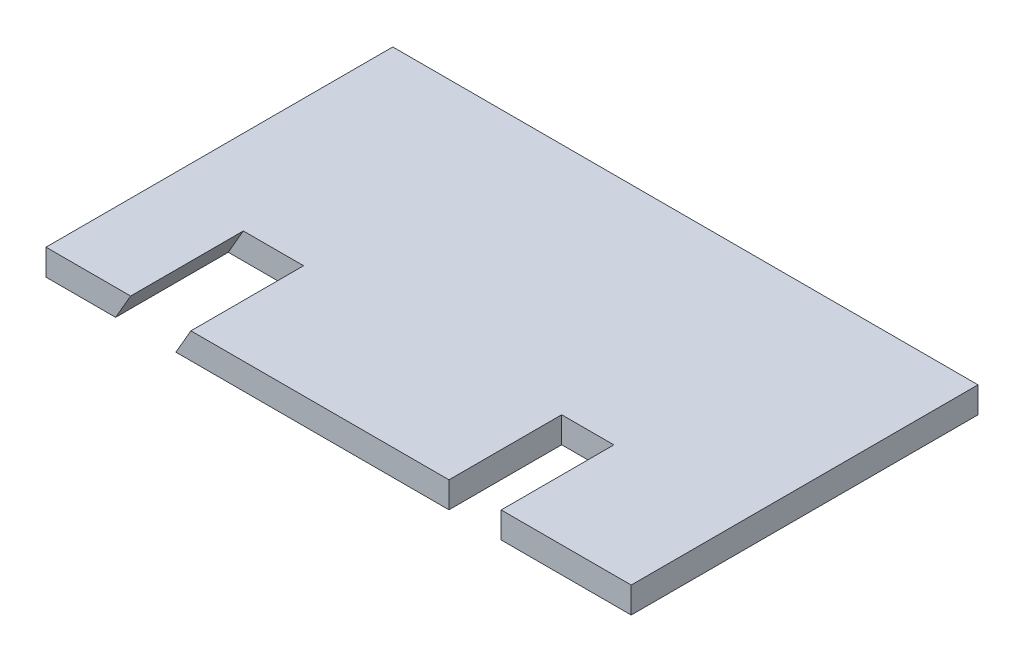
ISO-10303-21;
HEADER;
FILE_DESCRIPTION(('STEP AP214'),'2;1');
FILE_NAME('part.step','',(''),(''),'','','');
FILE_SCHEMA(('AUTOMOTIVE_DESIGN { 1 0 10303 214 1 1 1 1 }'));
ENDSEC;
DATA;
#1=APPLICATION_CONTEXT('core data for automotive mechanical design processes');
#2=APPLICATION_PROTOCOL_DEFINITION('international standard','automotive_design',2000,#1);
#3=PRODUCT_CONTEXT('',#1,'mechanical');
#4=PRODUCT('Part','Part','',(#3));
#5=PRODUCT_RELATED_PRODUCT_CATEGORY('part','',(#4));
#6=PRODUCT_DEFINITION_FORMATION('','',#4);
#7=PRODUCT_DEFINITION_CONTEXT('part definition',#1,'design');
#8=PRODUCT_DEFINITION('design','',#6,#7);
#9=PRODUCT_DEFINITION_SHAPE('','',#8);
#10=(LENGTH_UNIT() NAMED_UNIT(*) SI_UNIT(.MILLI.,.METRE.));
#11=(NAMED_UNIT(*) PLANE_ANGLE_UNIT() SI_UNIT($,.RADIAN.));
#12=(NAMED_UNIT(*) SI_UNIT($,.STERADIAN.) SOLID_ANGLE_UNIT());
#13=UNCERTAINTY_MEASURE_WITH_UNIT(LENGTH_MEASURE(1.E-05),#10,'distance_accuracy_value','');
#14=(GEOMETRIC_REPRESENTATION_CONTEXT(3) GLOBAL_UNCERTAINTY_ASSIGNED_CONTEXT((#13)) GLOBAL_UNIT_ASSIGNED_CONTEXT((#10,
#11,#12)) REPRESENTATION_CONTEXT('',''));
#15=CARTESIAN_POINT('',(0.,0.,0.));
#16=DIRECTION('',(0.,0.,1.));
#17=DIRECTION('',(1.,0.,0.));
#18=AXIS2_PLACEMENT_3D('',#15,#16,#17);
#19=CARTESIAN_POINT('',(0.,0.,80.));
#20=DIRECTION('',(0.,0.,1.));
#21=DIRECTION('',(1.,0.,0.));
#22=AXIS2_PLACEMENT_3D('',#19,#20,#21);
#23=PLANE('',#22);
#24=DIRECTION('',(0.,-1.,0.));
#25=VECTOR('',#24,1.);
#26=CARTESIAN_POINT('',(25.46,3.,80.));
#27=LINE('',#26,#25);
#28=CARTESIAN_POINT('',(25.46,3.,80.));
#29=VERTEX_POINT('',#28);
#30=CARTESIAN_POINT('',(25.46,-3.,80.));
#31=VERTEX_POINT('',#30);
#32=EDGE_CURVE('E127',#29,#31,#27,.T.);
#33=ORIENTED_EDGE('',*,*,#32,.F.);
#34=DIRECTION('',(-1.,0.,0.));
#35=VECTOR('',#34,1.);
#36=CARTESIAN_POINT('',(-67.5,3.,80.));
#37=LINE('',#36,#35);
#38=CARTESIAN_POINT('',(-34.0758983848622,3.,80.));
#39=VERTEX_POINT('',#38);
#40=EDGE_CURVE('E192',#29,#39,#37,.T.);
#41=ORIENTED_EDGE('',*,*,#40,.T.);
#42=DIRECTION('',(0.5,0.866025403784439,0.));
#43=VECTOR('',#42,1.);
#44=CARTESIAN_POINT('',(-34.0758983848622,3.,80.));
#45=LINE('',#44,#43);
#46=CARTESIAN_POINT('',(-37.54,-3.,80.));
#47=VERTEX_POINT('',#46);
#48=EDGE_CURVE('E164',#47,#39,#45,.T.);
#49=ORIENTED_EDGE('',*,*,#48,.F.);
#50=DIRECTION('',(1.,0.,0.));
#51=VECTOR('',#50,1.);
#52=CARTESIAN_POINT('',(-67.5,-3.,80.));
#53=LINE('',#52,#51);
#54=EDGE_CURVE('E199',#47,#31,#53,.T.);
#55=ORIENTED_EDGE('',*,*,#54,.T.);
#56=EDGE_LOOP('',(#33,#41,#49,#55));
#57=FACE_BOUND('',#56,.T.);
#58=ADVANCED_FACE('F33',(#57),#23,.T.);
#59=DIRECTION('',(0.,1.,0.));
#60=VECTOR('',#59,1.);
#61=CARTESIAN_POINT('',(37.5,3.,80.));
#62=LINE('',#61,#60);
#63=CARTESIAN_POINT('',(37.5,-3.,80.));
#64=VERTEX_POINT('',#63);
#65=CARTESIAN_POINT('',(37.5,3.,80.));
#66=VERTEX_POINT('',#65);
#67=EDGE_CURVE('E141',#64,#66,#62,.T.);
#68=ORIENTED_EDGE('',*,*,#67,.F.);
#69=CARTESIAN_POINT('',(67.5,-3.,80.));
#70=VERTEX_POINT('',#69);
#71=EDGE_CURVE('E194',#64,#70,#53,.T.);
#72=ORIENTED_EDGE('',*,*,#71,.T.);
#73=DIRECTION('',(0.,1.,0.));
#74=VECTOR('',#73,1.);
#75=CARTESIAN_POINT('',(67.5,3.,80.));
#76=LINE('',#75,#74);
#77=CARTESIAN_POINT('',(67.5,3.,80.));
#78=VERTEX_POINT('',#77);
#79=EDGE_CURVE('E183',#70,#78,#76,.T.);
#80=ORIENTED_EDGE('',*,*,#79,.T.);
#81=EDGE_CURVE('E188',#78,#66,#37,.T.);
#82=ORIENTED_EDGE('',*,*,#81,.T.);
#83=EDGE_LOOP('',(#68,#72,#80,#82));
#84=FACE_BOUND('',#83,.T.);
#85=ADVANCED_FACE('F230',(#84),#23,.T.);
#86=CARTESIAN_POINT('',(67.5,3.,80.));
#87=DIRECTION('',(-1.,0.,0.));
#88=DIRECTION('',(0.,0.,1.));
#89=AXIS2_PLACEMENT_3D('',#86,#87,#88);
#90=PLANE('',#89);
#91=DIRECTION('',(0.,1.,0.));
#92=VECTOR('',#91,1.);
#93=CARTESIAN_POINT('',(67.5,3.,0.));
#94=LINE('',#93,#92);
#95=CARTESIAN_POINT('',(67.5,-3.,0.));
#96=VERTEX_POINT('',#95);
#97=CARTESIAN_POINT('',(67.5,3.,0.));
#98=VERTEX_POINT('',#97);
#99=EDGE_CURVE('E155',#96,#98,#94,.T.);
#100=ORIENTED_EDGE('',*,*,#99,.T.);
#101=DIRECTION('',(0.,0.,-1.));
#102=VECTOR('',#101,1.);
#103=CARTESIAN_POINT('',(67.5,3.,80.));
#104=LINE('',#103,#102);
#105=EDGE_CURVE('E11',#78,#98,#104,.T.);
#106=ORIENTED_EDGE('',*,*,#105,.F.);
#107=ORIENTED_EDGE('',*,*,#79,.F.);
#108=DIRECTION('',(0.,0.,-1.));
#109=VECTOR('',#108,1.);
#110=CARTESIAN_POINT('',(67.5,-3.,80.));
#111=LINE('',#110,#109);
#112=EDGE_CURVE('E198',#70,#96,#111,.T.);
#113=ORIENTED_EDGE('',*,*,#112,.T.);
#114=EDGE_LOOP('',(#100,#106,#107,#113));
#115=FACE_BOUND('',#114,.T.);
#116=ADVANCED_FACE('F35',(#115),#90,.F.);
#117=CARTESIAN_POINT('',(-67.5,3.,80.));
#118=DIRECTION('',(0.,-1.,0.));
#119=DIRECTION('',(0.,0.,-1.));
#120=AXIS2_PLACEMENT_3D('',#117,#118,#119);
#121=PLANE('',#120);
#122=ORIENTED_EDGE('',*,*,#40,.F.);
#123=DIRECTION('',(0.,0.,1.));
#124=VECTOR('',#123,1.);
#125=CARTESIAN_POINT('',(25.46,3.,54.));
#126=LINE('',#125,#124);
#127=CARTESIAN_POINT('',(25.46,3.,54.));
#128=VERTEX_POINT('',#127);
#129=EDGE_CURVE('E153',#128,#29,#126,.T.);
#130=ORIENTED_EDGE('',*,*,#129,.F.);
#131=DIRECTION('',(-1.,0.,0.));
#132=VECTOR('',#131,1.);
#133=CARTESIAN_POINT('',(25.46,3.,54.));
#134=LINE('',#133,#132);
#135=CARTESIAN_POINT('',(37.5,3.,54.));
#136=VERTEX_POINT('',#135);
#137=EDGE_CURVE('E132',#136,#128,#134,.T.);
#138=ORIENTED_EDGE('',*,*,#137,.F.);
#139=DIRECTION('',(0.,0.,1.));
#140=VECTOR('',#139,1.);
#141=CARTESIAN_POINT('',(37.5,3.,54.));
#142=LINE('',#141,#140);
#143=EDGE_CURVE('E156',#136,#66,#142,.T.);
#144=ORIENTED_EDGE('',*,*,#143,.T.);
#145=ORIENTED_EDGE('',*,*,#81,.F.);
#146=ORIENTED_EDGE('',*,*,#105,.T.);
#147=DIRECTION('',(-1.,0.,0.));
#148=VECTOR('',#147,1.);
#149=CARTESIAN_POINT('',(-67.5,3.,0.));
#150=LINE('',#149,#148);
#151=CARTESIAN_POINT('',(-67.5,3.,0.));
#152=VERTEX_POINT('',#151);
#153=EDGE_CURVE('E202',#98,#152,#150,.T.);
#154=ORIENTED_EDGE('',*,*,#153,.T.);
#155=DIRECTION('',(0.,0.,-1.));
#156=VECTOR('',#155,1.);
#157=CARTESIAN_POINT('',(-67.5,3.,80.));
#158=LINE('',#157,#156);
#159=CARTESIAN_POINT('',(-67.5,3.,80.));
#160=VERTEX_POINT('',#159);
#161=EDGE_CURVE('E41',#160,#152,#158,.T.);
#162=ORIENTED_EDGE('',*,*,#161,.F.);
#163=CARTESIAN_POINT('',(-47.9784928669484,3.,80.));
#164=VERTEX_POINT('',#163);
#165=EDGE_CURVE('E186',#164,#160,#37,.T.);
#166=ORIENTED_EDGE('',*,*,#165,.F.);
#167=DIRECTION('',(0.,0.,1.));
#168=VECTOR('',#167,1.);
#169=CARTESIAN_POINT('',(-47.9784928669484,3.,54.));
#170=LINE('',#169,#168);
#171=CARTESIAN_POINT('',(-47.9784928669484,3.,54.));
#172=VERTEX_POINT('',#171);
#173=EDGE_CURVE('E56',#172,#164,#170,.T.);
#174=ORIENTED_EDGE('',*,*,#173,.F.);
#175=DIRECTION('',(-1.,0.,0.));
#176=VECTOR('',#175,1.);
#177=CARTESIAN_POINT('',(-47.9784928669484,3.,54.));
#178=LINE('',#177,#176);
#179=CARTESIAN_POINT('',(-34.0758983848622,3.,54.));
#180=VERTEX_POINT('',#179);
#181=EDGE_CURVE('E160',#180,#172,#178,.T.);
#182=ORIENTED_EDGE('',*,*,#181,.F.);
#183=DIRECTION('',(0.,0.,1.));
#184=VECTOR('',#183,1.);
#185=CARTESIAN_POINT('',(-34.0758983848622,3.,54.));
#186=LINE('',#185,#184);
#187=EDGE_CURVE('E151',#180,#39,#186,.T.);
#188=ORIENTED_EDGE('',*,*,#187,.T.);
#189=EDGE_LOOP('',(#122,#130,#138,#144,#145,#146,#154,#162,#166,#174,#182,#188));
#190=FACE_BOUND('',#189,.T.);
#191=ADVANCED_FACE('F243',(#190),#121,.F.);
#192=CARTESIAN_POINT('',(-67.5,3.,80.));
#193=DIRECTION('',(1.,0.,0.));
#194=DIRECTION('',(0.,0.,-1.));
#195=AXIS2_PLACEMENT_3D('',#192,#193,#194);
#196=PLANE('',#195);
#197=DIRECTION('',(0.,-1.,0.));
#198=VECTOR('',#197,1.);
#199=CARTESIAN_POINT('',(-67.5,3.,0.));
#200=LINE('',#199,#198);
#201=CARTESIAN_POINT('',(-67.5,-3.,0.));
#202=VERTEX_POINT('',#201);
#203=EDGE_CURVE('E204',#152,#202,#200,.T.);
#204=ORIENTED_EDGE('',*,*,#203,.T.);
#205=DIRECTION('',(0.,0.,-1.));
#206=VECTOR('',#205,1.);
#207=CARTESIAN_POINT('',(-67.5,-3.,80.));
#208=LINE('',#207,#206);
#209=CARTESIAN_POINT('',(-67.5,-3.,80.));
#210=VERTEX_POINT('',#209);
#211=EDGE_CURVE('E209',#210,#202,#208,.T.);
#212=ORIENTED_EDGE('',*,*,#211,.F.);
#213=DIRECTION('',(0.,-1.,0.));
#214=VECTOR('',#213,1.);
#215=CARTESIAN_POINT('',(-67.5,3.,80.));
#216=LINE('',#215,#214);
#217=EDGE_CURVE('E191',#160,#210,#216,.T.);
#218=ORIENTED_EDGE('',*,*,#217,.F.);
#219=ORIENTED_EDGE('',*,*,#161,.T.);
#220=EDGE_LOOP('',(#204,#212,#218,#219));
#221=FACE_BOUND('',#220,.T.);
#222=ADVANCED_FACE('F216',(#221),#196,.F.);
#223=CARTESIAN_POINT('',(-67.5,-3.,80.));
#224=DIRECTION('',(0.,1.,0.));
#225=DIRECTION('',(0.,0.,1.));
#226=AXIS2_PLACEMENT_3D('',#223,#224,#225);
#227=PLANE('',#226);
#228=DIRECTION('',(1.,0.,0.));
#229=VECTOR('',#228,1.);
#230=CARTESIAN_POINT('',(25.46,-3.,54.));
#231=LINE('',#230,#229);
#232=CARTESIAN_POINT('',(25.46,-3.,54.));
#233=VERTEX_POINT('',#232);
#234=CARTESIAN_POINT('',(37.5,-3.,54.));
#235=VERTEX_POINT('',#234);
#236=EDGE_CURVE('E138',#233,#235,#231,.T.);
#237=ORIENTED_EDGE('',*,*,#236,.F.);
#238=DIRECTION('',(0.,0.,1.));
#239=VECTOR('',#238,1.);
#240=CARTESIAN_POINT('',(25.46,-3.,54.));
#241=LINE('',#240,#239);
#242=EDGE_CURVE('E121',#233,#31,#241,.T.);
#243=ORIENTED_EDGE('',*,*,#242,.T.);
#244=ORIENTED_EDGE('',*,*,#54,.F.);
#245=DIRECTION('',(0.,0.,1.));
#246=VECTOR('',#245,1.);
#247=CARTESIAN_POINT('',(-37.54,-3.,54.));
#248=LINE('',#247,#246);
#249=CARTESIAN_POINT('',(-37.54,-3.,54.));
#250=VERTEX_POINT('',#249);
#251=EDGE_CURVE('E177',#250,#47,#248,.T.);
#252=ORIENTED_EDGE('',*,*,#251,.F.);
#253=DIRECTION('',(1.,0.,0.));
#254=VECTOR('',#253,1.);
#255=CARTESIAN_POINT('',(-51.4425944820862,-3.,54.));
#256=LINE('',#255,#254);
#257=CARTESIAN_POINT('',(-51.4425944820862,-3.,54.));
#258=VERTEX_POINT('',#257);
#259=EDGE_CURVE('E167',#258,#250,#256,.T.);
#260=ORIENTED_EDGE('',*,*,#259,.F.);
#261=DIRECTION('',(0.,0.,1.));
#262=VECTOR('',#261,1.);
#263=CARTESIAN_POINT('',(-51.4425944820862,-3.,54.));
#264=LINE('',#263,#262);
#265=CARTESIAN_POINT('',(-51.4425944820862,-3.,80.));
#266=VERTEX_POINT('',#265);
#267=EDGE_CURVE('E179',#258,#266,#264,.T.);
#268=ORIENTED_EDGE('',*,*,#267,.T.);
#269=EDGE_CURVE('E195',#210,#266,#53,.T.);
#270=ORIENTED_EDGE('',*,*,#269,.F.);
#271=ORIENTED_EDGE('',*,*,#211,.T.);
#272=DIRECTION('',(1.,0.,0.));
#273=VECTOR('',#272,1.);
#274=CARTESIAN_POINT('',(-67.5,-3.,0.));
#275=LINE('',#274,#273);
#276=EDGE_CURVE('E187',#202,#96,#275,.T.);
#277=ORIENTED_EDGE('',*,*,#276,.T.);
#278=ORIENTED_EDGE('',*,*,#112,.F.);
#279=ORIENTED_EDGE('',*,*,#71,.F.);
#280=DIRECTION('',(0.,0.,1.));
#281=VECTOR('',#280,1.);
#282=CARTESIAN_POINT('',(37.5,-3.,54.));
#283=LINE('',#282,#281);
#284=EDGE_CURVE('E48',#235,#64,#283,.T.);
#285=ORIENTED_EDGE('',*,*,#284,.F.);
#286=EDGE_LOOP('',(#237,#243,#244,#252,#260,#268,#270,#271,#277,#278,#279,#285));
#287=FACE_BOUND('',#286,.T.);
#288=ADVANCED_FACE('F143',(#287),#227,.F.);
#289=DIRECTION('',(-0.499999999999997,-0.86602540378444,0.));
#290=VECTOR('',#289,1.);
#291=CARTESIAN_POINT('',(-47.9784928669484,3.,80.));
#292=LINE('',#291,#290);
#293=EDGE_CURVE('E172',#164,#266,#292,.T.);
#294=ORIENTED_EDGE('',*,*,#293,.F.);
#295=ORIENTED_EDGE('',*,*,#165,.T.);
#296=ORIENTED_EDGE('',*,*,#217,.T.);
#297=ORIENTED_EDGE('',*,*,#269,.T.);
#298=EDGE_LOOP('',(#294,#295,#296,#297));
#299=FACE_BOUND('',#298,.T.);
#300=ADVANCED_FACE('F256',(#299),#23,.T.);
#301=CARTESIAN_POINT('',(0.,0.,0.));
#302=DIRECTION('',(0.,0.,1.));
#303=DIRECTION('',(1.,0.,0.));
#304=AXIS2_PLACEMENT_3D('',#301,#302,#303);
#305=PLANE('',#304);
#306=ORIENTED_EDGE('',*,*,#99,.F.);
#307=ORIENTED_EDGE('',*,*,#276,.F.);
#308=ORIENTED_EDGE('',*,*,#203,.F.);
#309=ORIENTED_EDGE('',*,*,#153,.F.);
#310=EDGE_LOOP('',(#306,#307,#308,#309));
#311=FACE_BOUND('',#310,.T.);
#312=ADVANCED_FACE('F223',(#311),#305,.F.);
#313=CARTESIAN_POINT('',(-34.0758983848622,3.,54.));
#314=DIRECTION('',(0.866025403784438,-0.5,0.));
#315=DIRECTION('',(0.5,0.866025403784438,0.));
#316=AXIS2_PLACEMENT_3D('',#313,#314,#315);
#317=PLANE('',#316);
#318=ORIENTED_EDGE('',*,*,#48,.T.);
#319=ORIENTED_EDGE('',*,*,#187,.F.);
#320=DIRECTION('',(0.5,0.866025403784439,0.));
#321=VECTOR('',#320,1.);
#322=CARTESIAN_POINT('',(-34.0758983848622,3.,54.));
#323=LINE('',#322,#321);
#324=EDGE_CURVE('E169',#250,#180,#323,.T.);
#325=ORIENTED_EDGE('',*,*,#324,.F.);
#326=ORIENTED_EDGE('',*,*,#251,.T.);
#327=EDGE_LOOP('',(#318,#319,#325,#326));
#328=FACE_BOUND('',#327,.T.);
#329=ADVANCED_FACE('F239',(#328),#317,.F.);
#330=CARTESIAN_POINT('',(-47.9784928669484,3.,54.));
#331=DIRECTION('',(-0.86602540378444,0.499999999999997,0.));
#332=DIRECTION('',(-0.499999999999997,-0.86602540378444,0.));
#333=AXIS2_PLACEMENT_3D('',#330,#331,#332);
#334=PLANE('',#333);
#335=ORIENTED_EDGE('',*,*,#293,.T.);
#336=ORIENTED_EDGE('',*,*,#267,.F.);
#337=DIRECTION('',(-0.499999999999997,-0.86602540378444,0.));
#338=VECTOR('',#337,1.);
#339=CARTESIAN_POINT('',(-47.9784928669484,3.,54.));
#340=LINE('',#339,#338);
#341=EDGE_CURVE('E163',#172,#258,#340,.T.);
#342=ORIENTED_EDGE('',*,*,#341,.F.);
#343=ORIENTED_EDGE('',*,*,#173,.T.);
#344=EDGE_LOOP('',(#335,#336,#342,#343));
#345=FACE_BOUND('',#344,.T.);
#346=ADVANCED_FACE('F268',(#345),#334,.F.);
#347=CARTESIAN_POINT('',(0.,0.,54.));
#348=DIRECTION('',(0.,0.,-1.));
#349=DIRECTION('',(-1.,0.,0.));
#350=AXIS2_PLACEMENT_3D('',#347,#348,#349);
#351=PLANE('',#350);
#352=ORIENTED_EDGE('',*,*,#181,.T.);
#353=ORIENTED_EDGE('',*,*,#341,.T.);
#354=ORIENTED_EDGE('',*,*,#259,.T.);
#355=ORIENTED_EDGE('',*,*,#324,.T.);
#356=EDGE_LOOP('',(#352,#353,#354,#355));
#357=FACE_BOUND('',#356,.T.);
#358=ADVANCED_FACE('F242',(#357),#351,.F.);
#359=CARTESIAN_POINT('',(25.46,3.,54.));
#360=DIRECTION('',(-1.,0.,0.));
#361=DIRECTION('',(0.,0.,1.));
#362=AXIS2_PLACEMENT_3D('',#359,#360,#361);
#363=PLANE('',#362);
#364=ORIENTED_EDGE('',*,*,#32,.T.);
#365=ORIENTED_EDGE('',*,*,#242,.F.);
#366=DIRECTION('',(0.,-1.,0.));
#367=VECTOR('',#366,1.);
#368=CARTESIAN_POINT('',(25.46,3.,54.));
#369=LINE('',#368,#367);
#370=EDGE_CURVE('E124',#128,#233,#369,.T.);
#371=ORIENTED_EDGE('',*,*,#370,.F.);
#372=ORIENTED_EDGE('',*,*,#129,.T.);
#373=EDGE_LOOP('',(#364,#365,#371,#372));
#374=FACE_BOUND('',#373,.T.);
#375=ADVANCED_FACE('F123',(#374),#363,.F.);
#376=CARTESIAN_POINT('',(37.5,3.,54.));
#377=DIRECTION('',(1.,0.,0.));
#378=DIRECTION('',(0.,0.,-1.));
#379=AXIS2_PLACEMENT_3D('',#376,#377,#378);
#380=PLANE('',#379);
#381=ORIENTED_EDGE('',*,*,#67,.T.);
#382=ORIENTED_EDGE('',*,*,#143,.F.);
#383=DIRECTION('',(0.,1.,0.));
#384=VECTOR('',#383,1.);
#385=CARTESIAN_POINT('',(37.5,3.,54.));
#386=LINE('',#385,#384);
#387=EDGE_CURVE('E145',#235,#136,#386,.T.);
#388=ORIENTED_EDGE('',*,*,#387,.F.);
#389=ORIENTED_EDGE('',*,*,#284,.T.);
#390=EDGE_LOOP('',(#381,#382,#388,#389));
#391=FACE_BOUND('',#390,.T.);
#392=ADVANCED_FACE('F245',(#391),#380,.F.);
#393=CARTESIAN_POINT('',(0.,0.,54.));
#394=DIRECTION('',(0.,0.,1.));
#395=DIRECTION('',(1.,0.,0.));
#396=AXIS2_PLACEMENT_3D('',#393,#394,#395);
#397=PLANE('',#396);
#398=ORIENTED_EDGE('',*,*,#370,.T.);
#399=ORIENTED_EDGE('',*,*,#236,.T.);
#400=ORIENTED_EDGE('',*,*,#387,.T.);
#401=ORIENTED_EDGE('',*,*,#137,.T.);
#402=EDGE_LOOP('',(#398,#399,#400,#401));
#403=FACE_BOUND('',#402,.T.);
#404=ADVANCED_FACE('F136',(#403),#397,.T.);
#405=CLOSED_SHELL('',(#58,#85,#116,#191,#222,#288,#300,#312,#329,#346,#358,#375,#392,#404));
#406=MANIFOLD_SOLID_BREP('B2',#405);
#407=ADVANCED_BREP_SHAPE_REPRESENTATION('',(#18,#406),#14);
#408=SHAPE_DEFINITION_REPRESENTATION(#9,#407);
ENDSEC;
END-ISO-10303-21;
